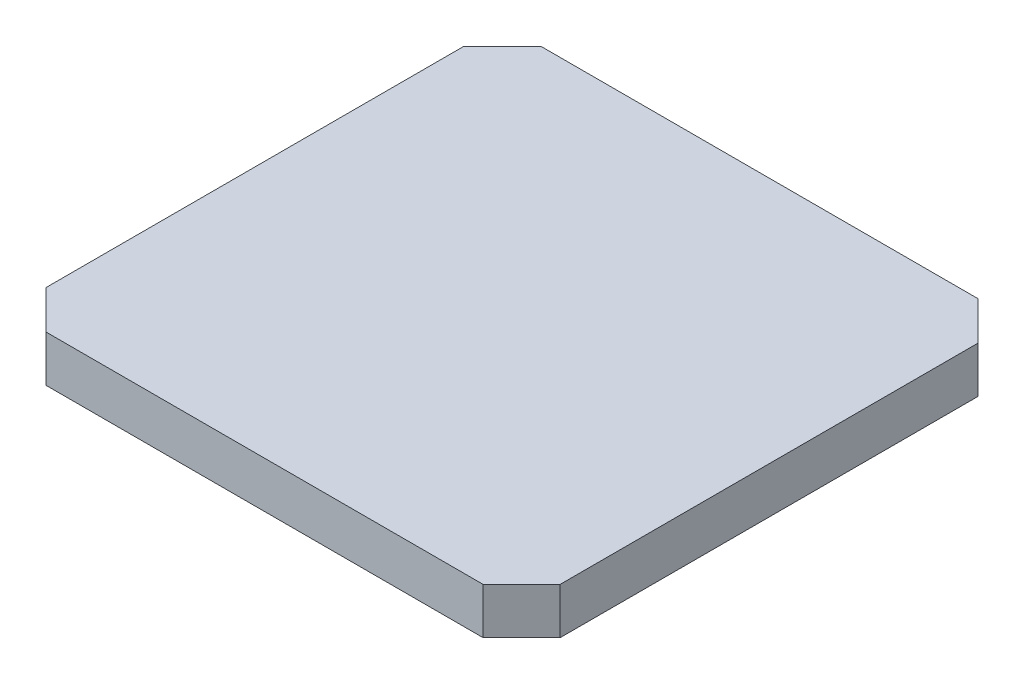
ISO-10303-21;
HEADER;
FILE_DESCRIPTION(('STEP AP214'),'2;1');
FILE_NAME('part.step','',(''),(''),'','','');
FILE_SCHEMA(('AUTOMOTIVE_DESIGN { 1 0 10303 214 1 1 1 1 }'));
ENDSEC;
DATA;
#1=APPLICATION_CONTEXT('core data for automotive mechanical design processes');
#2=APPLICATION_PROTOCOL_DEFINITION('international standard','automotive_design',2000,#1);
#3=PRODUCT_CONTEXT('',#1,'mechanical');
#4=PRODUCT('Part','Part','',(#3));
#5=PRODUCT_RELATED_PRODUCT_CATEGORY('part','',(#4));
#6=PRODUCT_DEFINITION_FORMATION('','',#4);
#7=PRODUCT_DEFINITION_CONTEXT('part definition',#1,'design');
#8=PRODUCT_DEFINITION('design','',#6,#7);
#9=PRODUCT_DEFINITION_SHAPE('','',#8);
#10=(LENGTH_UNIT() NAMED_UNIT(*) SI_UNIT(.MILLI.,.METRE.));
#11=(NAMED_UNIT(*) PLANE_ANGLE_UNIT() SI_UNIT($,.RADIAN.));
#12=(NAMED_UNIT(*) SI_UNIT($,.STERADIAN.) SOLID_ANGLE_UNIT());
#13=UNCERTAINTY_MEASURE_WITH_UNIT(LENGTH_MEASURE(1.E-05),#10,'distance_accuracy_value','');
#14=(GEOMETRIC_REPRESENTATION_CONTEXT(3) GLOBAL_UNCERTAINTY_ASSIGNED_CONTEXT((#13)) GLOBAL_UNIT_ASSIGNED_CONTEXT((#10,
#11,#12)) REPRESENTATION_CONTEXT('',''));
#15=CARTESIAN_POINT('',(0.,0.,0.));
#16=DIRECTION('',(0.,0.,1.));
#17=DIRECTION('',(1.,0.,0.));
#18=AXIS2_PLACEMENT_3D('',#15,#16,#17);
#19=CARTESIAN_POINT('',(-46.75,8.4,38.));
#20=DIRECTION('',(1.,0.,0.));
#21=DIRECTION('',(0.,0.,-1.));
#22=AXIS2_PLACEMENT_3D('',#19,#20,#21);
#23=PLANE('',#22);
#24=DIRECTION('',(0.,0.,1.));
#25=VECTOR('',#24,1.);
#26=CARTESIAN_POINT('',(-46.75,0.,38.));
#27=LINE('',#26,#25);
#28=CARTESIAN_POINT('',(-46.75,0.,-38.));
#29=VERTEX_POINT('',#28);
#30=CARTESIAN_POINT('',(-46.75,0.,38.));
#31=VERTEX_POINT('',#30);
#32=EDGE_CURVE('E129',#29,#31,#27,.T.);
#33=ORIENTED_EDGE('',*,*,#32,.T.);
#34=DIRECTION('',(0.,-1.,0.));
#35=VECTOR('',#34,1.);
#36=CARTESIAN_POINT('',(-46.75,8.4,38.));
#37=LINE('',#36,#35);
#38=CARTESIAN_POINT('',(-46.75,8.4,38.));
#39=VERTEX_POINT('',#38);
#40=EDGE_CURVE('E11',#39,#31,#37,.T.);
#41=ORIENTED_EDGE('',*,*,#40,.F.);
#42=DIRECTION('',(0.,0.,1.));
#43=VECTOR('',#42,1.);
#44=CARTESIAN_POINT('',(-46.75,8.4,38.));
#45=LINE('',#44,#43);
#46=CARTESIAN_POINT('',(-46.75,8.4,-38.));
#47=VERTEX_POINT('',#46);
#48=EDGE_CURVE('E143',#47,#39,#45,.T.);
#49=ORIENTED_EDGE('',*,*,#48,.F.);
#50=DIRECTION('',(0.,-1.,0.));
#51=VECTOR('',#50,1.);
#52=CARTESIAN_POINT('',(-46.75,8.4,-38.));
#53=LINE('',#52,#51);
#54=EDGE_CURVE('E125',#47,#29,#53,.T.);
#55=ORIENTED_EDGE('',*,*,#54,.T.);
#56=EDGE_LOOP('',(#33,#41,#49,#55));
#57=FACE_BOUND('',#56,.T.);
#58=ADVANCED_FACE('F33',(#57),#23,.F.);
#59=CARTESIAN_POINT('',(-39.75,8.4,45.));
#60=DIRECTION('',(0.707106781186548,0.,-0.707106781186548));
#61=DIRECTION('',(-0.707106781186548,0.,-0.707106781186548));
#62=AXIS2_PLACEMENT_3D('',#59,#60,#61);
#63=PLANE('',#62);
#64=DIRECTION('',(0.707106781186547,0.,0.707106781186547));
#65=VECTOR('',#64,1.);
#66=CARTESIAN_POINT('',(-39.75,0.,45.));
#67=LINE('',#66,#65);
#68=CARTESIAN_POINT('',(-39.75,0.,45.));
#69=VERTEX_POINT('',#68);
#70=EDGE_CURVE('E132',#31,#69,#67,.T.);
#71=ORIENTED_EDGE('',*,*,#70,.T.);
#72=DIRECTION('',(0.,-1.,0.));
#73=VECTOR('',#72,1.);
#74=CARTESIAN_POINT('',(-39.75,8.4,45.));
#75=LINE('',#74,#73);
#76=CARTESIAN_POINT('',(-39.75,8.4,45.));
#77=VERTEX_POINT('',#76);
#78=EDGE_CURVE('E41',#77,#69,#75,.T.);
#79=ORIENTED_EDGE('',*,*,#78,.F.);
#80=DIRECTION('',(0.707106781186547,0.,0.707106781186547));
#81=VECTOR('',#80,1.);
#82=CARTESIAN_POINT('',(-39.75,8.4,45.));
#83=LINE('',#82,#81);
#84=EDGE_CURVE('E92',#39,#77,#83,.T.);
#85=ORIENTED_EDGE('',*,*,#84,.F.);
#86=ORIENTED_EDGE('',*,*,#40,.T.);
#87=EDGE_LOOP('',(#71,#79,#85,#86));
#88=FACE_BOUND('',#87,.T.);
#89=ADVANCED_FACE('F178',(#88),#63,.F.);
#90=CARTESIAN_POINT('',(-39.75,8.4,45.));
#91=DIRECTION('',(0.,0.,-1.));
#92=DIRECTION('',(-1.,0.,0.));
#93=AXIS2_PLACEMENT_3D('',#90,#91,#92);
#94=PLANE('',#93);
#95=DIRECTION('',(1.,0.,0.));
#96=VECTOR('',#95,1.);
#97=CARTESIAN_POINT('',(-39.75,0.,45.));
#98=LINE('',#97,#96);
#99=CARTESIAN_POINT('',(39.75,0.,45.));
#100=VERTEX_POINT('',#99);
#101=EDGE_CURVE('E134',#69,#100,#98,.T.);
#102=ORIENTED_EDGE('',*,*,#101,.T.);
#103=DIRECTION('',(0.,-1.,0.));
#104=VECTOR('',#103,1.);
#105=CARTESIAN_POINT('',(39.75,8.4,45.));
#106=LINE('',#105,#104);
#107=CARTESIAN_POINT('',(39.75,8.4,45.));
#108=VERTEX_POINT('',#107);
#109=EDGE_CURVE('E150',#108,#100,#106,.T.);
#110=ORIENTED_EDGE('',*,*,#109,.F.);
#111=DIRECTION('',(1.,0.,0.));
#112=VECTOR('',#111,1.);
#113=CARTESIAN_POINT('',(-39.75,8.4,45.));
#114=LINE('',#113,#112);
#115=EDGE_CURVE('E158',#77,#108,#114,.T.);
#116=ORIENTED_EDGE('',*,*,#115,.F.);
#117=ORIENTED_EDGE('',*,*,#78,.T.);
#118=EDGE_LOOP('',(#102,#110,#116,#117));
#119=FACE_BOUND('',#118,.T.);
#120=ADVANCED_FACE('F156',(#119),#94,.F.);
#121=CARTESIAN_POINT('',(39.75,8.4,45.));
#122=DIRECTION('',(-0.707106781186547,0.,-0.707106781186548));
#123=DIRECTION('',(-0.707106781186548,0.,0.707106781186547));
#124=AXIS2_PLACEMENT_3D('',#121,#122,#123);
#125=PLANE('',#124);
#126=DIRECTION('',(0.707106781186548,0.,-0.707106781186547));
#127=VECTOR('',#126,1.);
#128=CARTESIAN_POINT('',(39.75,0.,45.));
#129=LINE('',#128,#127);
#130=CARTESIAN_POINT('',(46.75,0.,38.));
#131=VERTEX_POINT('',#130);
#132=EDGE_CURVE('E136',#100,#131,#129,.T.);
#133=ORIENTED_EDGE('',*,*,#132,.T.);
#134=DIRECTION('',(0.,-1.,0.));
#135=VECTOR('',#134,1.);
#136=CARTESIAN_POINT('',(46.75,8.4,38.));
#137=LINE('',#136,#135);
#138=CARTESIAN_POINT('',(46.75,8.4,38.));
#139=VERTEX_POINT('',#138);
#140=EDGE_CURVE('E147',#139,#131,#137,.T.);
#141=ORIENTED_EDGE('',*,*,#140,.F.);
#142=DIRECTION('',(0.707106781186548,0.,-0.707106781186547));
#143=VECTOR('',#142,1.);
#144=CARTESIAN_POINT('',(39.75,8.4,45.));
#145=LINE('',#144,#143);
#146=EDGE_CURVE('E170',#108,#139,#145,.T.);
#147=ORIENTED_EDGE('',*,*,#146,.F.);
#148=ORIENTED_EDGE('',*,*,#109,.T.);
#149=EDGE_LOOP('',(#133,#141,#147,#148));
#150=FACE_BOUND('',#149,.T.);
#151=ADVANCED_FACE('F166',(#150),#125,.F.);
#152=CARTESIAN_POINT('',(46.75,8.4,38.));
#153=DIRECTION('',(-1.,0.,0.));
#154=DIRECTION('',(0.,0.,1.));
#155=AXIS2_PLACEMENT_3D('',#152,#153,#154);
#156=PLANE('',#155);
#157=DIRECTION('',(0.,0.,-1.));
#158=VECTOR('',#157,1.);
#159=CARTESIAN_POINT('',(46.75,0.,38.));
#160=LINE('',#159,#158);
#161=CARTESIAN_POINT('',(46.75,0.,-38.));
#162=VERTEX_POINT('',#161);
#163=EDGE_CURVE('E138',#131,#162,#160,.T.);
#164=ORIENTED_EDGE('',*,*,#163,.T.);
#165=DIRECTION('',(0.,-1.,0.));
#166=VECTOR('',#165,1.);
#167=CARTESIAN_POINT('',(46.75,8.4,-38.));
#168=LINE('',#167,#166);
#169=CARTESIAN_POINT('',(46.75,8.4,-38.));
#170=VERTEX_POINT('',#169);
#171=EDGE_CURVE('E120',#170,#162,#168,.T.);
#172=ORIENTED_EDGE('',*,*,#171,.F.);
#173=DIRECTION('',(0.,0.,-1.));
#174=VECTOR('',#173,1.);
#175=CARTESIAN_POINT('',(46.75,8.4,38.));
#176=LINE('',#175,#174);
#177=EDGE_CURVE('E111',#139,#170,#176,.T.);
#178=ORIENTED_EDGE('',*,*,#177,.F.);
#179=ORIENTED_EDGE('',*,*,#140,.T.);
#180=EDGE_LOOP('',(#164,#172,#178,#179));
#181=FACE_BOUND('',#180,.T.);
#182=ADVANCED_FACE('F169',(#181),#156,.F.);
#183=CARTESIAN_POINT('',(39.75,8.4,-45.));
#184=DIRECTION('',(-0.707106781186548,0.,0.707106781186548));
#185=DIRECTION('',(0.707106781186548,0.,0.707106781186548));
#186=AXIS2_PLACEMENT_3D('',#183,#184,#185);
#187=PLANE('',#186);
#188=DIRECTION('',(-0.707106781186547,0.,-0.707106781186547));
#189=VECTOR('',#188,1.);
#190=CARTESIAN_POINT('',(39.75,0.,-45.));
#191=LINE('',#190,#189);
#192=CARTESIAN_POINT('',(39.75,0.,-45.));
#193=VERTEX_POINT('',#192);
#194=EDGE_CURVE('E119',#162,#193,#191,.T.);
#195=ORIENTED_EDGE('',*,*,#194,.T.);
#196=DIRECTION('',(0.,-1.,0.));
#197=VECTOR('',#196,1.);
#198=CARTESIAN_POINT('',(39.75,8.4,-45.));
#199=LINE('',#198,#197);
#200=CARTESIAN_POINT('',(39.75,8.4,-45.));
#201=VERTEX_POINT('',#200);
#202=EDGE_CURVE('E116',#201,#193,#199,.T.);
#203=ORIENTED_EDGE('',*,*,#202,.F.);
#204=DIRECTION('',(-0.707106781186547,0.,-0.707106781186547));
#205=VECTOR('',#204,1.);
#206=CARTESIAN_POINT('',(39.75,8.4,-45.));
#207=LINE('',#206,#205);
#208=EDGE_CURVE('E105',#170,#201,#207,.T.);
#209=ORIENTED_EDGE('',*,*,#208,.F.);
#210=ORIENTED_EDGE('',*,*,#171,.T.);
#211=EDGE_LOOP('',(#195,#203,#209,#210));
#212=FACE_BOUND('',#211,.T.);
#213=ADVANCED_FACE('F117',(#212),#187,.F.);
#214=CARTESIAN_POINT('',(-39.75,8.4,-45.));
#215=DIRECTION('',(0.,0.,1.));
#216=DIRECTION('',(1.,0.,0.));
#217=AXIS2_PLACEMENT_3D('',#214,#215,#216);
#218=PLANE('',#217);
#219=DIRECTION('',(-1.,0.,0.));
#220=VECTOR('',#219,1.);
#221=CARTESIAN_POINT('',(-39.75,0.,-45.));
#222=LINE('',#221,#220);
#223=CARTESIAN_POINT('',(-39.75,0.,-45.));
#224=VERTEX_POINT('',#223);
#225=EDGE_CURVE('E78',#193,#224,#222,.T.);
#226=ORIENTED_EDGE('',*,*,#225,.T.);
#227=DIRECTION('',(0.,-1.,0.));
#228=VECTOR('',#227,1.);
#229=CARTESIAN_POINT('',(-39.75,8.4,-45.));
#230=LINE('',#229,#228);
#231=CARTESIAN_POINT('',(-39.75,8.4,-45.));
#232=VERTEX_POINT('',#231);
#233=EDGE_CURVE('E121',#232,#224,#230,.T.);
#234=ORIENTED_EDGE('',*,*,#233,.F.);
#235=DIRECTION('',(-1.,0.,0.));
#236=VECTOR('',#235,1.);
#237=CARTESIAN_POINT('',(-39.75,8.4,-45.));
#238=LINE('',#237,#236);
#239=EDGE_CURVE('E109',#201,#232,#238,.T.);
#240=ORIENTED_EDGE('',*,*,#239,.F.);
#241=ORIENTED_EDGE('',*,*,#202,.T.);
#242=EDGE_LOOP('',(#226,#234,#240,#241));
#243=FACE_BOUND('',#242,.T.);
#244=ADVANCED_FACE('F123',(#243),#218,.F.);
#245=CARTESIAN_POINT('',(-46.75,8.4,-38.));
#246=DIRECTION('',(0.707106781186548,0.,0.707106781186548));
#247=DIRECTION('',(0.707106781186548,0.,-0.707106781186548));
#248=AXIS2_PLACEMENT_3D('',#245,#246,#247);
#249=PLANE('',#248);
#250=DIRECTION('',(-0.707106781186547,0.,0.707106781186547));
#251=VECTOR('',#250,1.);
#252=CARTESIAN_POINT('',(-46.75,0.,-38.));
#253=LINE('',#252,#251);
#254=EDGE_CURVE('E84',#224,#29,#253,.T.);
#255=ORIENTED_EDGE('',*,*,#254,.T.);
#256=ORIENTED_EDGE('',*,*,#54,.F.);
#257=DIRECTION('',(-0.707106781186547,0.,0.707106781186547));
#258=VECTOR('',#257,1.);
#259=CARTESIAN_POINT('',(-46.75,8.4,-38.));
#260=LINE('',#259,#258);
#261=EDGE_CURVE('E49',#232,#47,#260,.T.);
#262=ORIENTED_EDGE('',*,*,#261,.F.);
#263=ORIENTED_EDGE('',*,*,#233,.T.);
#264=EDGE_LOOP('',(#255,#256,#262,#263));
#265=FACE_BOUND('',#264,.T.);
#266=ADVANCED_FACE('F194',(#265),#249,.F.);
#267=CARTESIAN_POINT('',(0.,8.4,0.));
#268=DIRECTION('',(0.,-1.,0.));
#269=DIRECTION('',(0.,0.,-1.));
#270=AXIS2_PLACEMENT_3D('',#267,#268,#269);
#271=PLANE('',#270);
#272=ORIENTED_EDGE('',*,*,#48,.T.);
#273=ORIENTED_EDGE('',*,*,#84,.T.);
#274=ORIENTED_EDGE('',*,*,#115,.T.);
#275=ORIENTED_EDGE('',*,*,#146,.T.);
#276=ORIENTED_EDGE('',*,*,#177,.T.);
#277=ORIENTED_EDGE('',*,*,#208,.T.);
#278=ORIENTED_EDGE('',*,*,#239,.T.);
#279=ORIENTED_EDGE('',*,*,#261,.T.);
#280=EDGE_LOOP('',(#272,#273,#274,#275,#276,#277,#278,#279));
#281=FACE_BOUND('',#280,.T.);
#282=ADVANCED_FACE('F107',(#281),#271,.F.);
#283=CARTESIAN_POINT('',(0.,0.,0.));
#284=DIRECTION('',(0.,-1.,0.));
#285=DIRECTION('',(0.,0.,-1.));
#286=AXIS2_PLACEMENT_3D('',#283,#284,#285);
#287=PLANE('',#286);
#288=ORIENTED_EDGE('',*,*,#32,.F.);
#289=ORIENTED_EDGE('',*,*,#254,.F.);
#290=ORIENTED_EDGE('',*,*,#225,.F.);
#291=ORIENTED_EDGE('',*,*,#194,.F.);
#292=ORIENTED_EDGE('',*,*,#163,.F.);
#293=ORIENTED_EDGE('',*,*,#132,.F.);
#294=ORIENTED_EDGE('',*,*,#101,.F.);
#295=ORIENTED_EDGE('',*,*,#70,.F.);
#296=EDGE_LOOP('',(#288,#289,#290,#291,#292,#293,#294,#295));
#297=FACE_BOUND('',#296,.T.);
#298=ADVANCED_FACE('F162',(#297),#287,.T.);
#299=CLOSED_SHELL('',(#58,#89,#120,#151,#182,#213,#244,#266,#282,#298));
#300=MANIFOLD_SOLID_BREP('B2',#299);
#301=ADVANCED_BREP_SHAPE_REPRESENTATION('',(#18,#300),#14);
#302=SHAPE_DEFINITION_REPRESENTATION(#9,#301);
ENDSEC;
END-ISO-10303-21;
